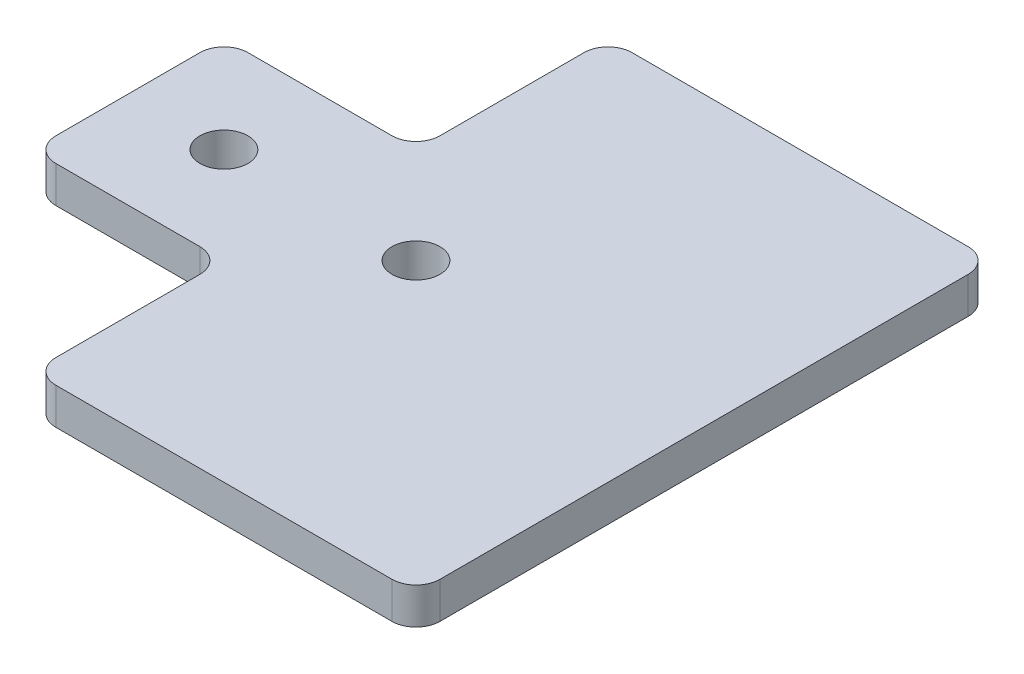
ISO-10303-21;
HEADER;
FILE_DESCRIPTION(('STEP AP214'),'2;1');
FILE_NAME('part.step','',(''),(''),'','','');
FILE_SCHEMA(('AUTOMOTIVE_DESIGN { 1 0 10303 214 1 1 1 1 }'));
ENDSEC;
DATA;
#1=APPLICATION_CONTEXT('core data for automotive mechanical design processes');
#2=APPLICATION_PROTOCOL_DEFINITION('international standard','automotive_design',2000,#1);
#3=PRODUCT_CONTEXT('',#1,'mechanical');
#4=PRODUCT('Part','Part','',(#3));
#5=PRODUCT_RELATED_PRODUCT_CATEGORY('part','',(#4));
#6=PRODUCT_DEFINITION_FORMATION('','',#4);
#7=PRODUCT_DEFINITION_CONTEXT('part definition',#1,'design');
#8=PRODUCT_DEFINITION('design','',#6,#7);
#9=PRODUCT_DEFINITION_SHAPE('','',#8);
#10=(LENGTH_UNIT() NAMED_UNIT(*) SI_UNIT(.MILLI.,.METRE.));
#11=(NAMED_UNIT(*) PLANE_ANGLE_UNIT() SI_UNIT($,.RADIAN.));
#12=(NAMED_UNIT(*) SI_UNIT($,.STERADIAN.) SOLID_ANGLE_UNIT());
#13=UNCERTAINTY_MEASURE_WITH_UNIT(LENGTH_MEASURE(1.E-05),#10,'distance_accuracy_value','');
#14=(GEOMETRIC_REPRESENTATION_CONTEXT(3) GLOBAL_UNCERTAINTY_ASSIGNED_CONTEXT((#13)) GLOBAL_UNIT_ASSIGNED_CONTEXT((#10,
#11,#12)) REPRESENTATION_CONTEXT('',''));
#15=CARTESIAN_POINT('',(0.,0.,0.));
#16=DIRECTION('',(0.,0.,1.));
#17=DIRECTION('',(1.,0.,0.));
#18=AXIS2_PLACEMENT_3D('',#15,#16,#17);
#19=CARTESIAN_POINT('',(25.4,4.826,-38.1));
#20=DIRECTION('',(0.,0.,1.));
#21=DIRECTION('',(1.,0.,0.));
#22=AXIS2_PLACEMENT_3D('',#19,#20,#21);
#23=PLANE('',#22);
#24=DIRECTION('',(-1.,0.,0.));
#25=VECTOR('',#24,1.);
#26=CARTESIAN_POINT('',(25.4,4.826,-38.1));
#27=LINE('',#26,#25);
#28=CARTESIAN_POINT('',(22.225,4.826,-38.1));
#29=VERTEX_POINT('',#28);
#30=CARTESIAN_POINT('',(-22.225,4.826,-38.1));
#31=VERTEX_POINT('',#30);
#32=EDGE_CURVE('E181',#29,#31,#27,.T.);
#33=ORIENTED_EDGE('',*,*,#32,.F.);
#34=DIRECTION('',(0.,-1.,0.));
#35=VECTOR('',#34,1.);
#36=CARTESIAN_POINT('',(22.225,4.826,-38.1));
#37=LINE('',#36,#35);
#38=CARTESIAN_POINT('',(22.225,0.,-38.1));
#39=VERTEX_POINT('',#38);
#40=EDGE_CURVE('E217',#29,#39,#37,.T.);
#41=ORIENTED_EDGE('',*,*,#40,.T.);
#42=DIRECTION('',(-1.,0.,0.));
#43=VECTOR('',#42,1.);
#44=CARTESIAN_POINT('',(25.4,0.,-38.1));
#45=LINE('',#44,#43);
#46=CARTESIAN_POINT('',(-22.225,0.,-38.1));
#47=VERTEX_POINT('',#46);
#48=EDGE_CURVE('E269',#39,#47,#45,.T.);
#49=ORIENTED_EDGE('',*,*,#48,.T.);
#50=DIRECTION('',(0.,-1.,0.));
#51=VECTOR('',#50,1.);
#52=CARTESIAN_POINT('',(-22.225,4.826,-38.1));
#53=LINE('',#52,#51);
#54=EDGE_CURVE('E215',#47,#31,#53,.F.);
#55=ORIENTED_EDGE('',*,*,#54,.T.);
#56=EDGE_LOOP('',(#33,#41,#49,#55));
#57=FACE_BOUND('',#56,.T.);
#58=ADVANCED_FACE('F39',(#57),#23,.F.);
#59=CARTESIAN_POINT('',(-25.4,4.826,-38.1));
#60=DIRECTION('',(1.,0.,0.));
#61=DIRECTION('',(0.,0.,-1.));
#62=AXIS2_PLACEMENT_3D('',#59,#60,#61);
#63=PLANE('',#62);
#64=DIRECTION('',(0.,0.,1.));
#65=VECTOR('',#64,1.);
#66=CARTESIAN_POINT('',(-25.4,4.826,-38.1));
#67=LINE('',#66,#65);
#68=CARTESIAN_POINT('',(-25.4,4.826,-34.925));
#69=VERTEX_POINT('',#68);
#70=CARTESIAN_POINT('',(-25.4,4.826,-15.875));
#71=VERTEX_POINT('',#70);
#72=EDGE_CURVE('E293',#69,#71,#67,.T.);
#73=ORIENTED_EDGE('',*,*,#72,.F.);
#74=DIRECTION('',(0.,-1.,0.));
#75=VECTOR('',#74,1.);
#76=CARTESIAN_POINT('',(-25.4,4.826,-34.925));
#77=LINE('',#76,#75);
#78=CARTESIAN_POINT('',(-25.4,0.,-34.925));
#79=VERTEX_POINT('',#78);
#80=EDGE_CURVE('E222',#69,#79,#77,.T.);
#81=ORIENTED_EDGE('',*,*,#80,.T.);
#82=DIRECTION('',(0.,0.,1.));
#83=VECTOR('',#82,1.);
#84=CARTESIAN_POINT('',(-25.4,0.,-38.1));
#85=LINE('',#84,#83);
#86=CARTESIAN_POINT('',(-25.4,0.,-15.875));
#87=VERTEX_POINT('',#86);
#88=EDGE_CURVE('E272',#79,#87,#85,.T.);
#89=ORIENTED_EDGE('',*,*,#88,.T.);
#90=DIRECTION('',(0.,-1.,0.));
#91=VECTOR('',#90,1.);
#92=CARTESIAN_POINT('',(-25.4,4.826,-15.875));
#93=LINE('',#92,#91);
#94=EDGE_CURVE('E220',#87,#71,#93,.F.);
#95=ORIENTED_EDGE('',*,*,#94,.T.);
#96=EDGE_LOOP('',(#73,#81,#89,#95));
#97=FACE_BOUND('',#96,.T.);
#98=ADVANCED_FACE('F337',(#97),#63,.F.);
#99=CARTESIAN_POINT('',(-25.4,4.826,-12.7));
#100=DIRECTION('',(0.,0.,1.));
#101=DIRECTION('',(1.,0.,0.));
#102=AXIS2_PLACEMENT_3D('',#99,#100,#101);
#103=PLANE('',#102);
#104=DIRECTION('',(-1.,0.,0.));
#105=VECTOR('',#104,1.);
#106=CARTESIAN_POINT('',(-25.4,0.,-12.7));
#107=LINE('',#106,#105);
#108=CARTESIAN_POINT('',(-28.575,0.,-12.7));
#109=VERTEX_POINT('',#108);
#110=CARTESIAN_POINT('',(-47.625,0.,-12.7));
#111=VERTEX_POINT('',#110);
#112=EDGE_CURVE('E276',#109,#111,#107,.T.);
#113=ORIENTED_EDGE('',*,*,#112,.T.);
#114=DIRECTION('',(0.,-1.,0.));
#115=VECTOR('',#114,1.);
#116=CARTESIAN_POINT('',(-47.625,4.826,-12.7));
#117=LINE('',#116,#115);
#118=CARTESIAN_POINT('',(-47.625,4.826,-12.7));
#119=VERTEX_POINT('',#118);
#120=EDGE_CURVE('E238',#111,#119,#117,.F.);
#121=ORIENTED_EDGE('',*,*,#120,.T.);
#122=DIRECTION('',(-1.,0.,0.));
#123=VECTOR('',#122,1.);
#124=CARTESIAN_POINT('',(-25.4,4.826,-12.7));
#125=LINE('',#124,#123);
#126=CARTESIAN_POINT('',(-28.575,4.826,-12.7));
#127=VERTEX_POINT('',#126);
#128=EDGE_CURVE('E292',#127,#119,#125,.T.);
#129=ORIENTED_EDGE('',*,*,#128,.F.);
#130=DIRECTION('',(0.,-1.,0.));
#131=VECTOR('',#130,1.);
#132=CARTESIAN_POINT('',(-28.575,0.,-12.7));
#133=LINE('',#132,#131);
#134=EDGE_CURVE('E235',#127,#109,#133,.T.);
#135=ORIENTED_EDGE('',*,*,#134,.T.);
#136=EDGE_LOOP('',(#113,#121,#129,#135));
#137=FACE_BOUND('',#136,.T.);
#138=ADVANCED_FACE('F343',(#137),#103,.F.);
#139=CARTESIAN_POINT('',(-50.8,4.826,-12.7));
#140=DIRECTION('',(1.,0.,0.));
#141=DIRECTION('',(0.,0.,-1.));
#142=AXIS2_PLACEMENT_3D('',#139,#140,#141);
#143=PLANE('',#142);
#144=DIRECTION('',(0.,0.,1.));
#145=VECTOR('',#144,1.);
#146=CARTESIAN_POINT('',(-50.8,0.,-12.7));
#147=LINE('',#146,#145);
#148=CARTESIAN_POINT('',(-50.8,0.,-9.52499999999999));
#149=VERTEX_POINT('',#148);
#150=CARTESIAN_POINT('',(-50.8,0.,9.52500000000001));
#151=VERTEX_POINT('',#150);
#152=EDGE_CURVE('E253',#149,#151,#147,.T.);
#153=ORIENTED_EDGE('',*,*,#152,.T.);
#154=DIRECTION('',(0.,-1.,0.));
#155=VECTOR('',#154,1.);
#156=CARTESIAN_POINT('',(-50.8,4.826,9.52500000000001));
#157=LINE('',#156,#155);
#158=CARTESIAN_POINT('',(-50.8,4.826,9.52500000000001));
#159=VERTEX_POINT('',#158);
#160=EDGE_CURVE('E233',#151,#159,#157,.F.);
#161=ORIENTED_EDGE('',*,*,#160,.T.);
#162=DIRECTION('',(0.,0.,1.));
#163=VECTOR('',#162,1.);
#164=CARTESIAN_POINT('',(-50.8,4.826,-12.7));
#165=LINE('',#164,#163);
#166=CARTESIAN_POINT('',(-50.8,4.826,-9.52499999999999));
#167=VERTEX_POINT('',#166);
#168=EDGE_CURVE('E264',#167,#159,#165,.T.);
#169=ORIENTED_EDGE('',*,*,#168,.F.);
#170=DIRECTION('',(0.,-1.,0.));
#171=VECTOR('',#170,1.);
#172=CARTESIAN_POINT('',(-50.8,4.826,-9.52499999999999));
#173=LINE('',#172,#171);
#174=EDGE_CURVE('E230',#167,#149,#173,.T.);
#175=ORIENTED_EDGE('',*,*,#174,.T.);
#176=EDGE_LOOP('',(#153,#161,#169,#175));
#177=FACE_BOUND('',#176,.T.);
#178=ADVANCED_FACE('F283',(#177),#143,.F.);
#179=CARTESIAN_POINT('',(-50.8,4.826,12.7));
#180=DIRECTION('',(0.,0.,-1.));
#181=DIRECTION('',(-1.,0.,0.));
#182=AXIS2_PLACEMENT_3D('',#179,#180,#181);
#183=PLANE('',#182);
#184=DIRECTION('',(1.,0.,0.));
#185=VECTOR('',#184,1.);
#186=CARTESIAN_POINT('',(-50.8,4.826,12.7));
#187=LINE('',#186,#185);
#188=CARTESIAN_POINT('',(-47.625,4.826,12.7));
#189=VERTEX_POINT('',#188);
#190=CARTESIAN_POINT('',(-28.575,4.826,12.7));
#191=VERTEX_POINT('',#190);
#192=EDGE_CURVE('E259',#189,#191,#187,.T.);
#193=ORIENTED_EDGE('',*,*,#192,.F.);
#194=DIRECTION('',(0.,-1.,0.));
#195=VECTOR('',#194,1.);
#196=CARTESIAN_POINT('',(-47.625,4.826,12.7));
#197=LINE('',#196,#195);
#198=CARTESIAN_POINT('',(-47.625,0.,12.7));
#199=VERTEX_POINT('',#198);
#200=EDGE_CURVE('E227',#189,#199,#197,.T.);
#201=ORIENTED_EDGE('',*,*,#200,.T.);
#202=DIRECTION('',(1.,0.,0.));
#203=VECTOR('',#202,1.);
#204=CARTESIAN_POINT('',(-50.8,0.,12.7));
#205=LINE('',#204,#203);
#206=CARTESIAN_POINT('',(-28.575,0.,12.7));
#207=VERTEX_POINT('',#206);
#208=EDGE_CURVE('E183',#199,#207,#205,.T.);
#209=ORIENTED_EDGE('',*,*,#208,.T.);
#210=DIRECTION('',(0.,-1.,0.));
#211=VECTOR('',#210,1.);
#212=CARTESIAN_POINT('',(-28.575,4.826,12.7));
#213=LINE('',#212,#211);
#214=EDGE_CURVE('E225',#207,#191,#213,.F.);
#215=ORIENTED_EDGE('',*,*,#214,.T.);
#216=EDGE_LOOP('',(#193,#201,#209,#215));
#217=FACE_BOUND('',#216,.T.);
#218=ADVANCED_FACE('F250',(#217),#183,.F.);
#219=CARTESIAN_POINT('',(-25.4,4.826,12.7));
#220=DIRECTION('',(1.,0.,0.));
#221=DIRECTION('',(0.,0.,-1.));
#222=AXIS2_PLACEMENT_3D('',#219,#220,#221);
#223=PLANE('',#222);
#224=DIRECTION('',(0.,0.,1.));
#225=VECTOR('',#224,1.);
#226=CARTESIAN_POINT('',(-25.4,0.,12.7));
#227=LINE('',#226,#225);
#228=CARTESIAN_POINT('',(-25.4,0.,15.875));
#229=VERTEX_POINT('',#228);
#230=CARTESIAN_POINT('',(-25.4,0.,34.925));
#231=VERTEX_POINT('',#230);
#232=EDGE_CURVE('E179',#229,#231,#227,.T.);
#233=ORIENTED_EDGE('',*,*,#232,.T.);
#234=DIRECTION('',(0.,-1.,0.));
#235=VECTOR('',#234,1.);
#236=CARTESIAN_POINT('',(-25.4,4.826,34.925));
#237=LINE('',#236,#235);
#238=CARTESIAN_POINT('',(-25.4,4.826,34.925));
#239=VERTEX_POINT('',#238);
#240=EDGE_CURVE('E158',#231,#239,#237,.F.);
#241=ORIENTED_EDGE('',*,*,#240,.T.);
#242=DIRECTION('',(0.,0.,1.));
#243=VECTOR('',#242,1.);
#244=CARTESIAN_POINT('',(-25.4,4.826,12.7));
#245=LINE('',#244,#243);
#246=CARTESIAN_POINT('',(-25.4,4.826,15.875));
#247=VERTEX_POINT('',#246);
#248=EDGE_CURVE('E258',#247,#239,#245,.T.);
#249=ORIENTED_EDGE('',*,*,#248,.F.);
#250=DIRECTION('',(0.,-1.,0.));
#251=VECTOR('',#250,1.);
#252=CARTESIAN_POINT('',(-25.4,0.,15.875));
#253=LINE('',#252,#251);
#254=EDGE_CURVE('E163',#247,#229,#253,.T.);
#255=ORIENTED_EDGE('',*,*,#254,.T.);
#256=EDGE_LOOP('',(#233,#241,#249,#255));
#257=FACE_BOUND('',#256,.T.);
#258=ADVANCED_FACE('F261',(#257),#223,.F.);
#259=CARTESIAN_POINT('',(25.4,4.826,38.1));
#260=DIRECTION('',(0.,0.,-1.));
#261=DIRECTION('',(-1.,0.,0.));
#262=AXIS2_PLACEMENT_3D('',#259,#260,#261);
#263=PLANE('',#262);
#264=DIRECTION('',(1.,0.,0.));
#265=VECTOR('',#264,1.);
#266=CARTESIAN_POINT('',(25.4,4.826,38.1));
#267=LINE('',#266,#265);
#268=CARTESIAN_POINT('',(-22.225,4.826,38.1));
#269=VERTEX_POINT('',#268);
#270=CARTESIAN_POINT('',(22.225,4.826,38.1));
#271=VERTEX_POINT('',#270);
#272=EDGE_CURVE('E172',#269,#271,#267,.T.);
#273=ORIENTED_EDGE('',*,*,#272,.F.);
#274=DIRECTION('',(0.,-1.,0.));
#275=VECTOR('',#274,1.);
#276=CARTESIAN_POINT('',(-22.225,4.826,38.1));
#277=LINE('',#276,#275);
#278=CARTESIAN_POINT('',(-22.225,0.,38.1));
#279=VERTEX_POINT('',#278);
#280=EDGE_CURVE('E157',#269,#279,#277,.T.);
#281=ORIENTED_EDGE('',*,*,#280,.T.);
#282=DIRECTION('',(1.,0.,0.));
#283=VECTOR('',#282,1.);
#284=CARTESIAN_POINT('',(25.4,0.,38.1));
#285=LINE('',#284,#283);
#286=CARTESIAN_POINT('',(22.225,0.,38.1));
#287=VERTEX_POINT('',#286);
#288=EDGE_CURVE('E170',#279,#287,#285,.T.);
#289=ORIENTED_EDGE('',*,*,#288,.T.);
#290=DIRECTION('',(0.,-1.,0.));
#291=VECTOR('',#290,1.);
#292=CARTESIAN_POINT('',(22.225,4.826,38.1));
#293=LINE('',#292,#291);
#294=EDGE_CURVE('E174',#287,#271,#293,.F.);
#295=ORIENTED_EDGE('',*,*,#294,.T.);
#296=EDGE_LOOP('',(#273,#281,#289,#295));
#297=FACE_BOUND('',#296,.T.);
#298=ADVANCED_FACE('F169',(#297),#263,.F.);
#299=CARTESIAN_POINT('',(25.4,4.826,38.1));
#300=DIRECTION('',(-1.,0.,0.));
#301=DIRECTION('',(0.,0.,1.));
#302=AXIS2_PLACEMENT_3D('',#299,#300,#301);
#303=PLANE('',#302);
#304=DIRECTION('',(0.,0.,-1.));
#305=VECTOR('',#304,1.);
#306=CARTESIAN_POINT('',(25.4,4.826,38.1));
#307=LINE('',#306,#305);
#308=CARTESIAN_POINT('',(25.4,4.826,34.925));
#309=VERTEX_POINT('',#308);
#310=CARTESIAN_POINT('',(25.4,4.826,-34.925));
#311=VERTEX_POINT('',#310);
#312=EDGE_CURVE('E187',#309,#311,#307,.T.);
#313=ORIENTED_EDGE('',*,*,#312,.F.);
#314=DIRECTION('',(0.,-1.,0.));
#315=VECTOR('',#314,1.);
#316=CARTESIAN_POINT('',(25.4,4.826,34.925));
#317=LINE('',#316,#315);
#318=CARTESIAN_POINT('',(25.4,0.,34.925));
#319=VERTEX_POINT('',#318);
#320=EDGE_CURVE('E212',#309,#319,#317,.T.);
#321=ORIENTED_EDGE('',*,*,#320,.T.);
#322=DIRECTION('',(0.,0.,-1.));
#323=VECTOR('',#322,1.);
#324=CARTESIAN_POINT('',(25.4,0.,38.1));
#325=LINE('',#324,#323);
#326=CARTESIAN_POINT('',(25.4,0.,-34.925));
#327=VERTEX_POINT('',#326);
#328=EDGE_CURVE('E178',#319,#327,#325,.T.);
#329=ORIENTED_EDGE('',*,*,#328,.T.);
#330=DIRECTION('',(0.,-1.,0.));
#331=VECTOR('',#330,1.);
#332=CARTESIAN_POINT('',(25.4,4.826,-34.925));
#333=LINE('',#332,#331);
#334=EDGE_CURVE('E54',#327,#311,#333,.F.);
#335=ORIENTED_EDGE('',*,*,#334,.T.);
#336=EDGE_LOOP('',(#313,#321,#329,#335));
#337=FACE_BOUND('',#336,.T.);
#338=ADVANCED_FACE('F323',(#337),#303,.F.);
#339=CARTESIAN_POINT('',(0.,4.826,0.));
#340=DIRECTION('',(0.,1.,0.));
#341=DIRECTION('',(0.,0.,1.));
#342=AXIS2_PLACEMENT_3D('',#339,#340,#341);
#343=PLANE('',#342);
#344=CARTESIAN_POINT('',(-12.7,4.826,0.));
#345=DIRECTION('',(0.,1.,0.));
#346=DIRECTION('',(0.,0.,1.));
#347=AXIS2_PLACEMENT_3D('',#344,#345,#346);
#348=CIRCLE('',#347,3.175);
#349=CARTESIAN_POINT('',(-12.7,4.826,3.175));
#350=VERTEX_POINT('',#349);
#351=EDGE_CURVE('E306',#350,#350,#348,.T.);
#352=ORIENTED_EDGE('',*,*,#351,.F.);
#353=EDGE_LOOP('',(#352));
#354=FACE_BOUND('',#353,.T.);
#355=CARTESIAN_POINT('',(-38.1,4.826,0.));
#356=DIRECTION('',(0.,1.,0.));
#357=DIRECTION('',(0.,0.,1.));
#358=AXIS2_PLACEMENT_3D('',#355,#356,#357);
#359=CIRCLE('',#358,3.175);
#360=CARTESIAN_POINT('',(-38.1,4.826,3.175));
#361=VERTEX_POINT('',#360);
#362=EDGE_CURVE('E300',#361,#361,#359,.T.);
#363=ORIENTED_EDGE('',*,*,#362,.F.);
#364=EDGE_LOOP('',(#363));
#365=FACE_BOUND('',#364,.T.);
#366=ORIENTED_EDGE('',*,*,#248,.T.);
#367=CARTESIAN_POINT('',(-22.225,4.826,34.925));
#368=DIRECTION('',(0.,1.,0.));
#369=DIRECTION('',(0.,0.,1.));
#370=AXIS2_PLACEMENT_3D('',#367,#368,#369);
#371=CIRCLE('',#370,3.175);
#372=EDGE_CURVE('E209',#239,#269,#371,.T.);
#373=ORIENTED_EDGE('',*,*,#372,.T.);
#374=ORIENTED_EDGE('',*,*,#272,.T.);
#375=CARTESIAN_POINT('',(22.225,4.826,34.925));
#376=DIRECTION('',(0.,1.,0.));
#377=DIRECTION('',(0.,0.,1.));
#378=AXIS2_PLACEMENT_3D('',#375,#376,#377);
#379=CIRCLE('',#378,3.175);
#380=EDGE_CURVE('E61',#271,#309,#379,.T.);
#381=ORIENTED_EDGE('',*,*,#380,.T.);
#382=ORIENTED_EDGE('',*,*,#312,.T.);
#383=CARTESIAN_POINT('',(22.225,4.826,-34.925));
#384=DIRECTION('',(0.,1.,0.));
#385=DIRECTION('',(0.,0.,1.));
#386=AXIS2_PLACEMENT_3D('',#383,#384,#385);
#387=CIRCLE('',#386,3.175);
#388=EDGE_CURVE('E206',#311,#29,#387,.T.);
#389=ORIENTED_EDGE('',*,*,#388,.T.);
#390=ORIENTED_EDGE('',*,*,#32,.T.);
#391=CARTESIAN_POINT('',(-22.225,4.826,-34.925));
#392=DIRECTION('',(0.,1.,0.));
#393=DIRECTION('',(0.,0.,1.));
#394=AXIS2_PLACEMENT_3D('',#391,#392,#393);
#395=CIRCLE('',#394,3.175);
#396=EDGE_CURVE('E204',#31,#69,#395,.T.);
#397=ORIENTED_EDGE('',*,*,#396,.T.);
#398=ORIENTED_EDGE('',*,*,#72,.T.);
#399=CARTESIAN_POINT('',(-28.575,4.826,-15.875));
#400=DIRECTION('',(0.,1.,0.));
#401=DIRECTION('',(0.,0.,1.));
#402=AXIS2_PLACEMENT_3D('',#399,#400,#401);
#403=CIRCLE('',#402,3.175);
#404=EDGE_CURVE('E242',#71,#127,#403,.F.);
#405=ORIENTED_EDGE('',*,*,#404,.T.);
#406=ORIENTED_EDGE('',*,*,#128,.T.);
#407=CARTESIAN_POINT('',(-47.625,4.826,-9.52499999999999));
#408=DIRECTION('',(0.,1.,0.));
#409=DIRECTION('',(0.,0.,1.));
#410=AXIS2_PLACEMENT_3D('',#407,#408,#409);
#411=CIRCLE('',#410,3.175);
#412=EDGE_CURVE('E200',#119,#167,#411,.T.);
#413=ORIENTED_EDGE('',*,*,#412,.T.);
#414=ORIENTED_EDGE('',*,*,#168,.T.);
#415=CARTESIAN_POINT('',(-47.625,4.826,9.52500000000001));
#416=DIRECTION('',(0.,1.,0.));
#417=DIRECTION('',(0.,0.,1.));
#418=AXIS2_PLACEMENT_3D('',#415,#416,#417);
#419=CIRCLE('',#418,3.175);
#420=EDGE_CURVE('E202',#159,#189,#419,.T.);
#421=ORIENTED_EDGE('',*,*,#420,.T.);
#422=ORIENTED_EDGE('',*,*,#192,.T.);
#423=CARTESIAN_POINT('',(-28.575,4.826,15.875));
#424=DIRECTION('',(0.,1.,0.));
#425=DIRECTION('',(0.,0.,1.));
#426=AXIS2_PLACEMENT_3D('',#423,#424,#425);
#427=CIRCLE('',#426,3.175);
#428=EDGE_CURVE('E11',#191,#247,#427,.F.);
#429=ORIENTED_EDGE('',*,*,#428,.T.);
#430=EDGE_LOOP('',(#366,#373,#374,#381,#382,#389,#390,#397,#398,#405,#406,#413,#414,#421,#422,#429));
#431=FACE_BOUND('',#430,.T.);
#432=ADVANCED_FACE('F257',(#354,#365,#431),#343,.T.);
#433=CARTESIAN_POINT('',(0.,0.,0.));
#434=DIRECTION('',(0.,1.,0.));
#435=DIRECTION('',(0.,0.,1.));
#436=AXIS2_PLACEMENT_3D('',#433,#434,#435);
#437=PLANE('',#436);
#438=CARTESIAN_POINT('',(-12.7,0.,0.));
#439=DIRECTION('',(0.,1.,0.));
#440=DIRECTION('',(0.,0.,1.));
#441=AXIS2_PLACEMENT_3D('',#438,#439,#440);
#442=CIRCLE('',#441,3.175);
#443=CARTESIAN_POINT('',(-12.7,0.,3.175));
#444=VERTEX_POINT('',#443);
#445=EDGE_CURVE('E303',#444,#444,#442,.T.);
#446=ORIENTED_EDGE('',*,*,#445,.T.);
#447=EDGE_LOOP('',(#446));
#448=FACE_BOUND('',#447,.T.);
#449=CARTESIAN_POINT('',(-38.1,0.,0.));
#450=DIRECTION('',(0.,1.,0.));
#451=DIRECTION('',(0.,0.,1.));
#452=AXIS2_PLACEMENT_3D('',#449,#450,#451);
#453=CIRCLE('',#452,3.175);
#454=CARTESIAN_POINT('',(-38.1,0.,3.175));
#455=VERTEX_POINT('',#454);
#456=EDGE_CURVE('E273',#455,#455,#453,.T.);
#457=ORIENTED_EDGE('',*,*,#456,.T.);
#458=EDGE_LOOP('',(#457));
#459=FACE_BOUND('',#458,.T.);
#460=ORIENTED_EDGE('',*,*,#288,.F.);
#461=CARTESIAN_POINT('',(-22.225,0.,34.925));
#462=DIRECTION('',(0.,1.,0.));
#463=DIRECTION('',(0.,0.,1.));
#464=AXIS2_PLACEMENT_3D('',#461,#462,#463);
#465=CIRCLE('',#464,3.175);
#466=EDGE_CURVE('E153',#279,#231,#465,.F.);
#467=ORIENTED_EDGE('',*,*,#466,.T.);
#468=ORIENTED_EDGE('',*,*,#232,.F.);
#469=CARTESIAN_POINT('',(-28.575,0.,15.875));
#470=DIRECTION('',(0.,1.,0.));
#471=DIRECTION('',(0.,0.,1.));
#472=AXIS2_PLACEMENT_3D('',#469,#470,#471);
#473=CIRCLE('',#472,3.175);
#474=EDGE_CURVE('E47',#229,#207,#473,.T.);
#475=ORIENTED_EDGE('',*,*,#474,.T.);
#476=ORIENTED_EDGE('',*,*,#208,.F.);
#477=CARTESIAN_POINT('',(-47.625,0.,9.52500000000001));
#478=DIRECTION('',(0.,1.,0.));
#479=DIRECTION('',(0.,0.,1.));
#480=AXIS2_PLACEMENT_3D('',#477,#478,#479);
#481=CIRCLE('',#480,3.175);
#482=EDGE_CURVE('E190',#199,#151,#481,.F.);
#483=ORIENTED_EDGE('',*,*,#482,.T.);
#484=ORIENTED_EDGE('',*,*,#152,.F.);
#485=CARTESIAN_POINT('',(-47.625,0.,-9.52499999999999));
#486=DIRECTION('',(0.,1.,0.));
#487=DIRECTION('',(0.,0.,1.));
#488=AXIS2_PLACEMENT_3D('',#485,#486,#487);
#489=CIRCLE('',#488,3.175);
#490=EDGE_CURVE('E173',#149,#111,#489,.F.);
#491=ORIENTED_EDGE('',*,*,#490,.T.);
#492=ORIENTED_EDGE('',*,*,#112,.F.);
#493=CARTESIAN_POINT('',(-28.575,0.,-15.875));
#494=DIRECTION('',(0.,1.,0.));
#495=DIRECTION('',(0.,0.,1.));
#496=AXIS2_PLACEMENT_3D('',#493,#494,#495);
#497=CIRCLE('',#496,3.175);
#498=EDGE_CURVE('E240',#109,#87,#497,.T.);
#499=ORIENTED_EDGE('',*,*,#498,.T.);
#500=ORIENTED_EDGE('',*,*,#88,.F.);
#501=CARTESIAN_POINT('',(-22.225,0.,-34.925));
#502=DIRECTION('',(0.,1.,0.));
#503=DIRECTION('',(0.,0.,1.));
#504=AXIS2_PLACEMENT_3D('',#501,#502,#503);
#505=CIRCLE('',#504,3.175);
#506=EDGE_CURVE('E192',#79,#47,#505,.F.);
#507=ORIENTED_EDGE('',*,*,#506,.T.);
#508=ORIENTED_EDGE('',*,*,#48,.F.);
#509=CARTESIAN_POINT('',(22.225,0.,-34.925));
#510=DIRECTION('',(0.,1.,0.));
#511=DIRECTION('',(0.,0.,1.));
#512=AXIS2_PLACEMENT_3D('',#509,#510,#511);
#513=CIRCLE('',#512,3.175);
#514=EDGE_CURVE('E194',#39,#327,#513,.F.);
#515=ORIENTED_EDGE('',*,*,#514,.T.);
#516=ORIENTED_EDGE('',*,*,#328,.F.);
#517=CARTESIAN_POINT('',(22.225,0.,34.925));
#518=DIRECTION('',(0.,1.,0.));
#519=DIRECTION('',(0.,0.,1.));
#520=AXIS2_PLACEMENT_3D('',#517,#518,#519);
#521=CIRCLE('',#520,3.175);
#522=EDGE_CURVE('E164',#319,#287,#521,.F.);
#523=ORIENTED_EDGE('',*,*,#522,.T.);
#524=EDGE_LOOP('',(#460,#467,#468,#475,#476,#483,#484,#491,#492,#499,#500,#507,#508,#515,#516,#523));
#525=FACE_BOUND('',#524,.T.);
#526=ADVANCED_FACE('F176',(#448,#459,#525),#437,.F.);
#527=CARTESIAN_POINT('',(-22.225,4.826,34.925));
#528=DIRECTION('',(0.,-1.,0.));
#529=DIRECTION('',(0.,0.,-1.));
#530=AXIS2_PLACEMENT_3D('',#527,#528,#529);
#531=CYLINDRICAL_SURFACE('',#530,3.175);
#532=ORIENTED_EDGE('',*,*,#372,.F.);
#533=ORIENTED_EDGE('',*,*,#240,.F.);
#534=ORIENTED_EDGE('',*,*,#466,.F.);
#535=ORIENTED_EDGE('',*,*,#280,.F.);
#536=EDGE_LOOP('',(#532,#533,#534,#535));
#537=FACE_BOUND('',#536,.T.);
#538=ADVANCED_FACE('F156',(#537),#531,.T.);
#539=CARTESIAN_POINT('',(22.225,4.826,34.925));
#540=DIRECTION('',(0.,-1.,0.));
#541=DIRECTION('',(0.,0.,-1.));
#542=AXIS2_PLACEMENT_3D('',#539,#540,#541);
#543=CYLINDRICAL_SURFACE('',#542,3.175);
#544=ORIENTED_EDGE('',*,*,#380,.F.);
#545=ORIENTED_EDGE('',*,*,#294,.F.);
#546=ORIENTED_EDGE('',*,*,#522,.F.);
#547=ORIENTED_EDGE('',*,*,#320,.F.);
#548=EDGE_LOOP('',(#544,#545,#546,#547));
#549=FACE_BOUND('',#548,.T.);
#550=ADVANCED_FACE('F351',(#549),#543,.T.);
#551=CARTESIAN_POINT('',(22.225,4.826,-34.925));
#552=DIRECTION('',(0.,-1.,0.));
#553=DIRECTION('',(0.,0.,-1.));
#554=AXIS2_PLACEMENT_3D('',#551,#552,#553);
#555=CYLINDRICAL_SURFACE('',#554,3.175);
#556=ORIENTED_EDGE('',*,*,#388,.F.);
#557=ORIENTED_EDGE('',*,*,#334,.F.);
#558=ORIENTED_EDGE('',*,*,#514,.F.);
#559=ORIENTED_EDGE('',*,*,#40,.F.);
#560=EDGE_LOOP('',(#556,#557,#558,#559));
#561=FACE_BOUND('',#560,.T.);
#562=ADVANCED_FACE('F354',(#561),#555,.T.);
#563=CARTESIAN_POINT('',(-22.225,4.826,-34.925));
#564=DIRECTION('',(0.,-1.,0.));
#565=DIRECTION('',(0.,0.,-1.));
#566=AXIS2_PLACEMENT_3D('',#563,#564,#565);
#567=CYLINDRICAL_SURFACE('',#566,3.175);
#568=ORIENTED_EDGE('',*,*,#396,.F.);
#569=ORIENTED_EDGE('',*,*,#54,.F.);
#570=ORIENTED_EDGE('',*,*,#506,.F.);
#571=ORIENTED_EDGE('',*,*,#80,.F.);
#572=EDGE_LOOP('',(#568,#569,#570,#571));
#573=FACE_BOUND('',#572,.T.);
#574=ADVANCED_FACE('F358',(#573),#567,.T.);
#575=CARTESIAN_POINT('',(-47.625,4.826,9.52500000000001));
#576=DIRECTION('',(0.,-1.,0.));
#577=DIRECTION('',(0.,0.,-1.));
#578=AXIS2_PLACEMENT_3D('',#575,#576,#577);
#579=CYLINDRICAL_SURFACE('',#578,3.175);
#580=ORIENTED_EDGE('',*,*,#420,.F.);
#581=ORIENTED_EDGE('',*,*,#160,.F.);
#582=ORIENTED_EDGE('',*,*,#482,.F.);
#583=ORIENTED_EDGE('',*,*,#200,.F.);
#584=EDGE_LOOP('',(#580,#581,#582,#583));
#585=FACE_BOUND('',#584,.T.);
#586=ADVANCED_FACE('F289',(#585),#579,.T.);
#587=CARTESIAN_POINT('',(-47.625,4.826,-9.52499999999999));
#588=DIRECTION('',(0.,-1.,0.));
#589=DIRECTION('',(0.,0.,-1.));
#590=AXIS2_PLACEMENT_3D('',#587,#588,#589);
#591=CYLINDRICAL_SURFACE('',#590,3.175);
#592=ORIENTED_EDGE('',*,*,#412,.F.);
#593=ORIENTED_EDGE('',*,*,#120,.F.);
#594=ORIENTED_EDGE('',*,*,#490,.F.);
#595=ORIENTED_EDGE('',*,*,#174,.F.);
#596=EDGE_LOOP('',(#592,#593,#594,#595));
#597=FACE_BOUND('',#596,.T.);
#598=ADVANCED_FACE('F365',(#597),#591,.T.);
#599=CARTESIAN_POINT('',(-28.575,4.826,-15.875));
#600=DIRECTION('',(0.,1.,0.));
#601=DIRECTION('',(0.,0.,1.));
#602=AXIS2_PLACEMENT_3D('',#599,#600,#601);
#603=CYLINDRICAL_SURFACE('',#602,3.175);
#604=ORIENTED_EDGE('',*,*,#404,.F.);
#605=ORIENTED_EDGE('',*,*,#94,.F.);
#606=ORIENTED_EDGE('',*,*,#498,.F.);
#607=ORIENTED_EDGE('',*,*,#134,.F.);
#608=EDGE_LOOP('',(#604,#605,#606,#607));
#609=FACE_BOUND('',#608,.T.);
#610=ADVANCED_FACE('F334',(#609),#603,.F.);
#611=CARTESIAN_POINT('',(-28.575,4.826,15.875));
#612=DIRECTION('',(0.,1.,0.));
#613=DIRECTION('',(0.,0.,1.));
#614=AXIS2_PLACEMENT_3D('',#611,#612,#613);
#615=CYLINDRICAL_SURFACE('',#614,3.175);
#616=ORIENTED_EDGE('',*,*,#428,.F.);
#617=ORIENTED_EDGE('',*,*,#214,.F.);
#618=ORIENTED_EDGE('',*,*,#474,.F.);
#619=ORIENTED_EDGE('',*,*,#254,.F.);
#620=EDGE_LOOP('',(#616,#617,#618,#619));
#621=FACE_BOUND('',#620,.T.);
#622=ADVANCED_FACE('F41',(#621),#615,.F.);
#623=CARTESIAN_POINT('',(-38.1,0.,0.));
#624=DIRECTION('',(0.,1.,0.));
#625=DIRECTION('',(0.,0.,1.));
#626=AXIS2_PLACEMENT_3D('',#623,#624,#625);
#627=CYLINDRICAL_SURFACE('',#626,3.175);
#628=ORIENTED_EDGE('',*,*,#456,.F.);
#629=EDGE_LOOP('',(#628));
#630=FACE_BOUND('',#629,.T.);
#631=ORIENTED_EDGE('',*,*,#362,.T.);
#632=EDGE_LOOP('',(#631));
#633=FACE_BOUND('',#632,.T.);
#634=ADVANCED_FACE('F317',(#630,#633),#627,.F.);
#635=CARTESIAN_POINT('',(-12.7,0.,0.));
#636=DIRECTION('',(0.,1.,0.));
#637=DIRECTION('',(0.,0.,1.));
#638=AXIS2_PLACEMENT_3D('',#635,#636,#637);
#639=CYLINDRICAL_SURFACE('',#638,3.175);
#640=ORIENTED_EDGE('',*,*,#445,.F.);
#641=EDGE_LOOP('',(#640));
#642=FACE_BOUND('',#641,.T.);
#643=ORIENTED_EDGE('',*,*,#351,.T.);
#644=EDGE_LOOP('',(#643));
#645=FACE_BOUND('',#644,.T.);
#646=ADVANCED_FACE('F314',(#642,#645),#639,.F.);
#647=CLOSED_SHELL('',(#58,#98,#138,#178,#218,#258,#298,#338,#432,#526,#538,#550,#562,#574,#586,
#598,#610,#622,#634,#646));
#648=MANIFOLD_SOLID_BREP('B2',#647);
#649=ADVANCED_BREP_SHAPE_REPRESENTATION('',(#18,#648),#14);
#650=SHAPE_DEFINITION_REPRESENTATION(#9,#649);
ENDSEC;
END-ISO-10303-21;
